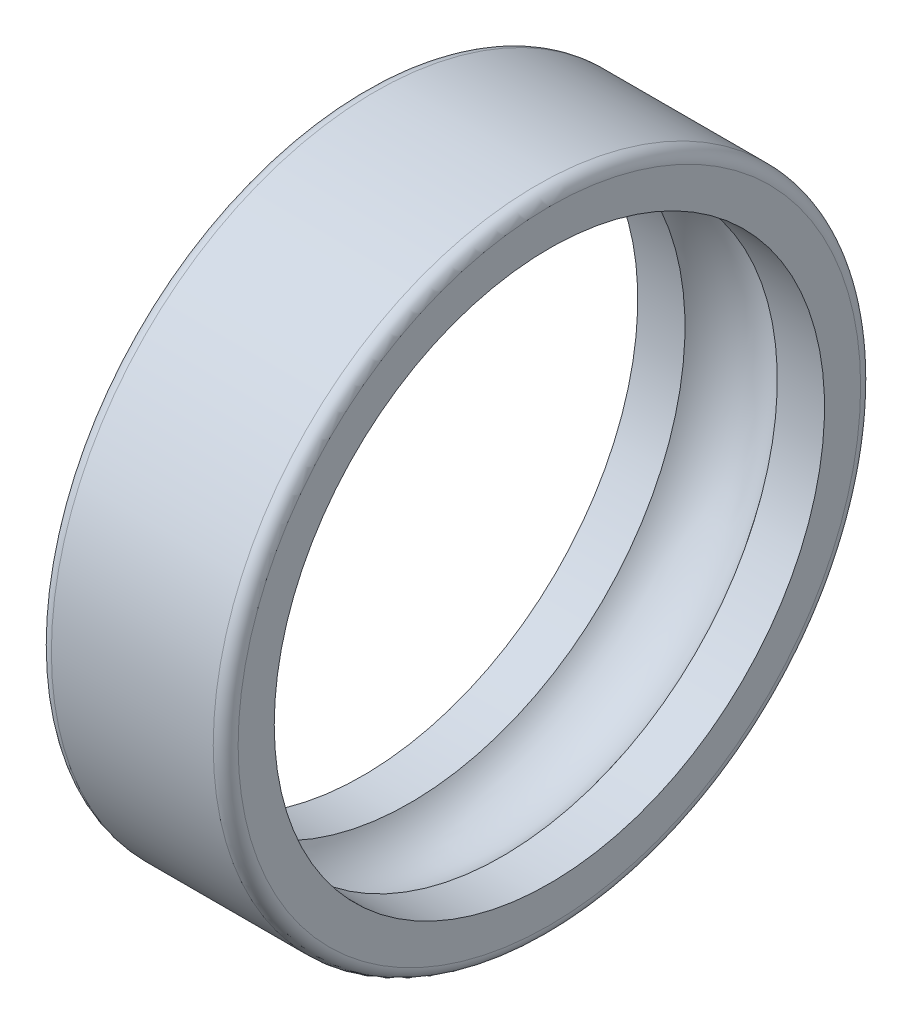
ISO-10303-21;
HEADER;
FILE_DESCRIPTION(('STEP AP214'),'2;1');
FILE_NAME('part.step','',(''),(''),'','','');
FILE_SCHEMA(('AUTOMOTIVE_DESIGN { 1 0 10303 214 1 1 1 1 }'));
ENDSEC;
DATA;
#1=APPLICATION_CONTEXT('core data for automotive mechanical design processes');
#2=APPLICATION_PROTOCOL_DEFINITION('international standard','automotive_design',2000,#1);
#3=PRODUCT_CONTEXT('',#1,'mechanical');
#4=PRODUCT('Part','Part','',(#3));
#5=PRODUCT_RELATED_PRODUCT_CATEGORY('part','',(#4));
#6=PRODUCT_DEFINITION_FORMATION('','',#4);
#7=PRODUCT_DEFINITION_CONTEXT('part definition',#1,'design');
#8=PRODUCT_DEFINITION('design','',#6,#7);
#9=PRODUCT_DEFINITION_SHAPE('','',#8);
#10=(LENGTH_UNIT() NAMED_UNIT(*) SI_UNIT(.MILLI.,.METRE.));
#11=(NAMED_UNIT(*) PLANE_ANGLE_UNIT() SI_UNIT($,.RADIAN.));
#12=(NAMED_UNIT(*) SI_UNIT($,.STERADIAN.) SOLID_ANGLE_UNIT());
#13=UNCERTAINTY_MEASURE_WITH_UNIT(LENGTH_MEASURE(1.E-05),#10,'distance_accuracy_value','');
#14=(GEOMETRIC_REPRESENTATION_CONTEXT(3) GLOBAL_UNCERTAINTY_ASSIGNED_CONTEXT((#13)) GLOBAL_UNIT_ASSIGNED_CONTEXT((#10,
#11,#12)) REPRESENTATION_CONTEXT('',''));
#15=CARTESIAN_POINT('',(0.,0.,0.));
#16=DIRECTION('',(0.,0.,1.));
#17=DIRECTION('',(1.,0.,0.));
#18=AXIS2_PLACEMENT_3D('',#15,#16,#17);
#19=CARTESIAN_POINT('',(0.,25.,0.));
#20=DIRECTION('',(1.,0.,0.));
#21=DIRECTION('',(0.,0.,-1.));
#22=AXIS2_PLACEMENT_3D('',#19,#20,#21);
#23=PLANE('',#22);
#24=CARTESIAN_POINT('',(0.,0.,0.));
#25=DIRECTION('',(-1.,0.,0.));
#26=DIRECTION('',(0.,0.,1.));
#27=AXIS2_PLACEMENT_3D('',#24,#25,#26);
#28=CIRCLE('',#27,22.1);
#29=CARTESIAN_POINT('',(0.,0.,22.1));
#30=VERTEX_POINT('',#29);
#31=EDGE_CURVE('E10',#30,#30,#28,.T.);
#32=ORIENTED_EDGE('',*,*,#31,.F.);
#33=EDGE_LOOP('',(#32));
#34=FACE_BOUND('',#33,.T.);
#35=CARTESIAN_POINT('',(0.,0.,0.));
#36=DIRECTION('',(-1.,0.,0.));
#37=DIRECTION('',(0.,0.,1.));
#38=AXIS2_PLACEMENT_3D('',#35,#36,#37);
#39=CIRCLE('',#38,25.);
#40=CARTESIAN_POINT('',(0.,0.,25.));
#41=VERTEX_POINT('',#40);
#42=EDGE_CURVE('E43',#41,#41,#39,.T.);
#43=ORIENTED_EDGE('',*,*,#42,.T.);
#44=EDGE_LOOP('',(#43));
#45=FACE_BOUND('',#44,.T.);
#46=ADVANCED_FACE('F15',(#34,#45),#23,.F.);
#47=CARTESIAN_POINT('',(0.,0.,0.));
#48=DIRECTION('',(-1.,0.,0.));
#49=DIRECTION('',(0.,0.,1.));
#50=AXIS2_PLACEMENT_3D('',#47,#48,#49);
#51=CYLINDRICAL_SURFACE('',#50,22.1);
#52=CARTESIAN_POINT('',(3.79223787170752,0.,0.));
#53=DIRECTION('',(-1.,0.,0.));
#54=DIRECTION('',(0.,0.,1.));
#55=AXIS2_PLACEMENT_3D('',#52,#53,#54);
#56=CIRCLE('',#55,22.1);
#57=CARTESIAN_POINT('',(3.79223787170752,0.,22.1));
#58=VERTEX_POINT('',#57);
#59=EDGE_CURVE('E21',#58,#58,#56,.T.);
#60=ORIENTED_EDGE('',*,*,#59,.F.);
#61=EDGE_LOOP('',(#60));
#62=FACE_BOUND('',#61,.T.);
#63=ORIENTED_EDGE('',*,*,#31,.T.);
#64=EDGE_LOOP('',(#63));
#65=FACE_BOUND('',#64,.T.);
#66=ADVANCED_FACE('F80',(#62,#65),#51,.F.);
#67=CARTESIAN_POINT('',(7.5,0.,0.));
#68=DIRECTION('',(-1.,0.,0.));
#69=DIRECTION('',(0.,0.,1.));
#70=AXIS2_PLACEMENT_3D('',#67,#68,#69);
#71=TOROIDAL_SURFACE('',#70,19.55,4.5);
#72=ORIENTED_EDGE('',*,*,#59,.T.);
#73=EDGE_LOOP('',(#72));
#74=FACE_BOUND('',#73,.T.);
#75=CARTESIAN_POINT('',(11.2077621282925,0.,0.));
#76=DIRECTION('',(-1.,0.,0.));
#77=DIRECTION('',(0.,0.,1.));
#78=AXIS2_PLACEMENT_3D('',#75,#76,#77);
#79=CIRCLE('',#78,22.1);
#80=CARTESIAN_POINT('',(11.2077621282925,0.,22.1));
#81=VERTEX_POINT('',#80);
#82=EDGE_CURVE('E25',#81,#81,#79,.T.);
#83=ORIENTED_EDGE('',*,*,#82,.F.);
#84=EDGE_LOOP('',(#83));
#85=FACE_BOUND('',#84,.T.);
#86=ADVANCED_FACE('F75',(#74,#85),#71,.F.);
#87=CARTESIAN_POINT('',(0.,0.,0.));
#88=DIRECTION('',(-1.,0.,0.));
#89=DIRECTION('',(0.,0.,1.));
#90=AXIS2_PLACEMENT_3D('',#87,#88,#89);
#91=CYLINDRICAL_SURFACE('',#90,22.1);
#92=CARTESIAN_POINT('',(15.,0.,0.));
#93=DIRECTION('',(-1.,0.,0.));
#94=DIRECTION('',(0.,0.,1.));
#95=AXIS2_PLACEMENT_3D('',#92,#93,#94);
#96=CIRCLE('',#95,22.1);
#97=CARTESIAN_POINT('',(15.,0.,22.1));
#98=VERTEX_POINT('',#97);
#99=EDGE_CURVE('E29',#98,#98,#96,.T.);
#100=ORIENTED_EDGE('',*,*,#99,.F.);
#101=EDGE_LOOP('',(#100));
#102=FACE_BOUND('',#101,.T.);
#103=ORIENTED_EDGE('',*,*,#82,.T.);
#104=EDGE_LOOP('',(#103));
#105=FACE_BOUND('',#104,.T.);
#106=ADVANCED_FACE('F69',(#102,#105),#91,.F.);
#107=CARTESIAN_POINT('',(15.,22.1,0.));
#108=DIRECTION('',(-1.,0.,0.));
#109=DIRECTION('',(0.,0.,1.));
#110=AXIS2_PLACEMENT_3D('',#107,#108,#109);
#111=PLANE('',#110);
#112=CARTESIAN_POINT('',(15.,0.,0.));
#113=DIRECTION('',(-1.,0.,0.));
#114=DIRECTION('',(0.,0.,1.));
#115=AXIS2_PLACEMENT_3D('',#112,#113,#114);
#116=CIRCLE('',#115,25.);
#117=CARTESIAN_POINT('',(15.,0.,25.));
#118=VERTEX_POINT('',#117);
#119=EDGE_CURVE('E34',#118,#118,#116,.T.);
#120=ORIENTED_EDGE('',*,*,#119,.F.);
#121=EDGE_LOOP('',(#120));
#122=FACE_BOUND('',#121,.T.);
#123=ORIENTED_EDGE('',*,*,#99,.T.);
#124=EDGE_LOOP('',(#123));
#125=FACE_BOUND('',#124,.T.);
#126=ADVANCED_FACE('F63',(#122,#125),#111,.F.);
#127=CARTESIAN_POINT('',(14.,0.,0.));
#128=DIRECTION('',(-1.,0.,0.));
#129=DIRECTION('',(0.,0.,1.));
#130=AXIS2_PLACEMENT_3D('',#127,#128,#129);
#131=TOROIDAL_SURFACE('',#130,25.,1.);
#132=CARTESIAN_POINT('',(14.,0.,0.));
#133=DIRECTION('',(-1.,0.,0.));
#134=DIRECTION('',(0.,0.,1.));
#135=AXIS2_PLACEMENT_3D('',#132,#133,#134);
#136=CIRCLE('',#135,26.);
#137=CARTESIAN_POINT('',(14.,0.,26.));
#138=VERTEX_POINT('',#137);
#139=EDGE_CURVE('E37',#138,#138,#136,.T.);
#140=ORIENTED_EDGE('',*,*,#139,.F.);
#141=EDGE_LOOP('',(#140));
#142=FACE_BOUND('',#141,.T.);
#143=ORIENTED_EDGE('',*,*,#119,.T.);
#144=EDGE_LOOP('',(#143));
#145=FACE_BOUND('',#144,.T.);
#146=ADVANCED_FACE('F57',(#142,#145),#131,.T.);
#147=CARTESIAN_POINT('',(0.,0.,0.));
#148=DIRECTION('',(-1.,0.,0.));
#149=DIRECTION('',(0.,0.,1.));
#150=AXIS2_PLACEMENT_3D('',#147,#148,#149);
#151=CYLINDRICAL_SURFACE('',#150,26.);
#152=CARTESIAN_POINT('',(1.,0.,0.));
#153=DIRECTION('',(-1.,0.,0.));
#154=DIRECTION('',(0.,0.,1.));
#155=AXIS2_PLACEMENT_3D('',#152,#153,#154);
#156=CIRCLE('',#155,26.);
#157=CARTESIAN_POINT('',(1.,0.,26.));
#158=VERTEX_POINT('',#157);
#159=EDGE_CURVE('E40',#158,#158,#156,.T.);
#160=ORIENTED_EDGE('',*,*,#159,.F.);
#161=EDGE_LOOP('',(#160));
#162=FACE_BOUND('',#161,.T.);
#163=ORIENTED_EDGE('',*,*,#139,.T.);
#164=EDGE_LOOP('',(#163));
#165=FACE_BOUND('',#164,.T.);
#166=ADVANCED_FACE('F51',(#162,#165),#151,.T.);
#167=CARTESIAN_POINT('',(1.,0.,0.));
#168=DIRECTION('',(-1.,0.,0.));
#169=DIRECTION('',(0.,0.,1.));
#170=AXIS2_PLACEMENT_3D('',#167,#168,#169);
#171=TOROIDAL_SURFACE('',#170,25.,1.);
#172=ORIENTED_EDGE('',*,*,#42,.F.);
#173=EDGE_LOOP('',(#172));
#174=FACE_BOUND('',#173,.T.);
#175=ORIENTED_EDGE('',*,*,#159,.T.);
#176=EDGE_LOOP('',(#175));
#177=FACE_BOUND('',#176,.T.);
#178=ADVANCED_FACE('F48',(#174,#177),#171,.T.);
#179=CLOSED_SHELL('',(#46,#66,#86,#106,#126,#146,#166,#178));
#180=MANIFOLD_SOLID_BREP('B1',#179);
#181=ADVANCED_BREP_SHAPE_REPRESENTATION('',(#18,#180),#14);
#182=SHAPE_DEFINITION_REPRESENTATION(#9,#181);
ENDSEC;
END-ISO-10303-21;
